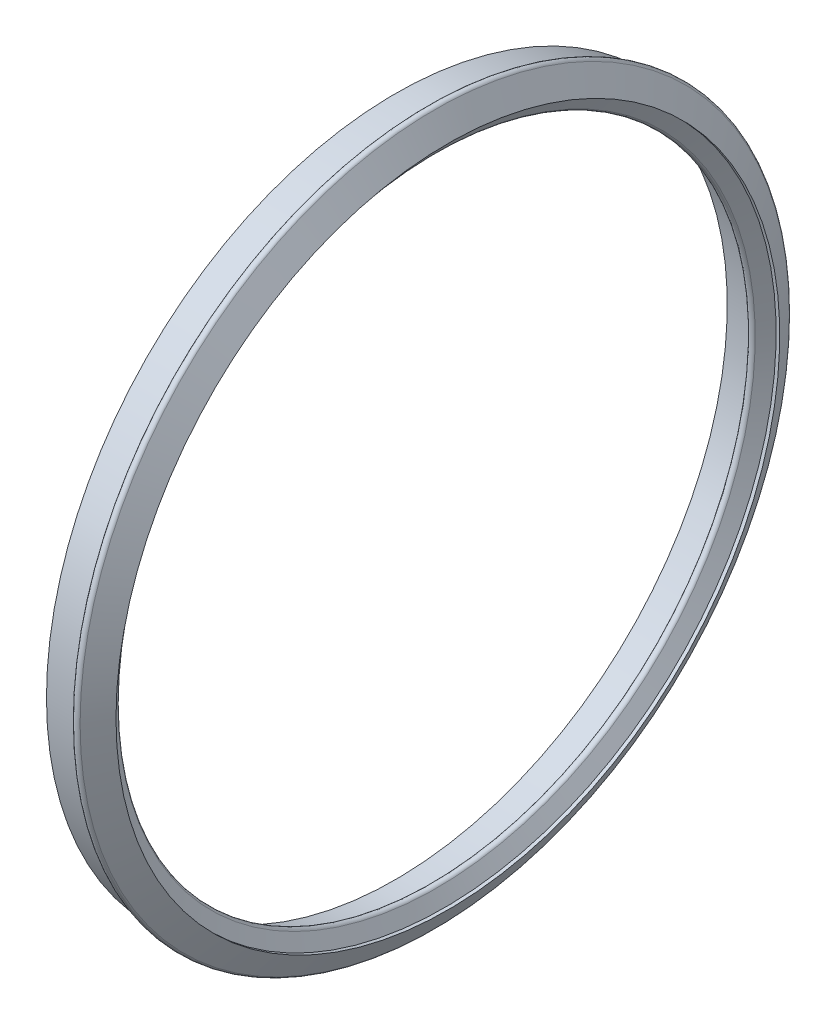
ISO-10303-21;
HEADER;
FILE_DESCRIPTION(('STEP AP214'),'2;1');
FILE_NAME('part.step','',(''),(''),'','','');
FILE_SCHEMA(('AUTOMOTIVE_DESIGN { 1 0 10303 214 1 1 1 1 }'));
ENDSEC;
DATA;
#1=APPLICATION_CONTEXT('core data for automotive mechanical design processes');
#2=APPLICATION_PROTOCOL_DEFINITION('international standard','automotive_design',2000,#1);
#3=PRODUCT_CONTEXT('',#1,'mechanical');
#4=PRODUCT('Part','Part','',(#3));
#5=PRODUCT_RELATED_PRODUCT_CATEGORY('part','',(#4));
#6=PRODUCT_DEFINITION_FORMATION('','',#4);
#7=PRODUCT_DEFINITION_CONTEXT('part definition',#1,'design');
#8=PRODUCT_DEFINITION('design','',#6,#7);
#9=PRODUCT_DEFINITION_SHAPE('','',#8);
#10=(LENGTH_UNIT() NAMED_UNIT(*) SI_UNIT(.MILLI.,.METRE.));
#11=(NAMED_UNIT(*) PLANE_ANGLE_UNIT() SI_UNIT($,.RADIAN.));
#12=(NAMED_UNIT(*) SI_UNIT($,.STERADIAN.) SOLID_ANGLE_UNIT());
#13=UNCERTAINTY_MEASURE_WITH_UNIT(LENGTH_MEASURE(1.E-05),#10,'distance_accuracy_value','');
#14=(GEOMETRIC_REPRESENTATION_CONTEXT(3) GLOBAL_UNCERTAINTY_ASSIGNED_CONTEXT((#13)) GLOBAL_UNIT_ASSIGNED_CONTEXT((#10,
#11,#12)) REPRESENTATION_CONTEXT('',''));
#15=CARTESIAN_POINT('',(0.,0.,0.));
#16=DIRECTION('',(0.,0.,1.));
#17=DIRECTION('',(1.,0.,0.));
#18=AXIS2_PLACEMENT_3D('',#15,#16,#17);
#19=CARTESIAN_POINT('',(0.,18.4,0.));
#20=DIRECTION('',(1.,0.,0.));
#21=DIRECTION('',(0.,0.,-1.));
#22=AXIS2_PLACEMENT_3D('',#19,#20,#21);
#23=PLANE('',#22);
#24=CARTESIAN_POINT('',(0.,0.,0.));
#25=DIRECTION('',(-1.,0.,0.));
#26=DIRECTION('',(0.,0.,1.));
#27=AXIS2_PLACEMENT_3D('',#24,#25,#26);
#28=CIRCLE('',#27,17.5);
#29=CARTESIAN_POINT('',(0.,0.,17.5));
#30=VERTEX_POINT('',#29);
#31=EDGE_CURVE('E10',#30,#30,#28,.T.);
#32=ORIENTED_EDGE('',*,*,#31,.F.);
#33=EDGE_LOOP('',(#32));
#34=FACE_BOUND('',#33,.T.);
#35=CARTESIAN_POINT('',(0.,0.,0.));
#36=DIRECTION('',(-1.,0.,0.));
#37=DIRECTION('',(0.,0.,1.));
#38=AXIS2_PLACEMENT_3D('',#35,#36,#37);
#39=CIRCLE('',#38,18.4);
#40=CARTESIAN_POINT('',(0.,0.,18.4));
#41=VERTEX_POINT('',#40);
#42=EDGE_CURVE('E71',#41,#41,#39,.T.);
#43=ORIENTED_EDGE('',*,*,#42,.T.);
#44=EDGE_LOOP('',(#43));
#45=FACE_BOUND('',#44,.T.);
#46=ADVANCED_FACE('F37',(#34,#45),#23,.F.);
#47=CARTESIAN_POINT('',(0.,0.,0.));
#48=DIRECTION('',(-1.,0.,0.));
#49=DIRECTION('',(0.,0.,1.));
#50=AXIS2_PLACEMENT_3D('',#47,#48,#49);
#51=CYLINDRICAL_SURFACE('',#50,17.5);
#52=CARTESIAN_POINT('',(1.42264973081043,0.,0.));
#53=DIRECTION('',(-1.,0.,0.));
#54=DIRECTION('',(0.,0.,1.));
#55=AXIS2_PLACEMENT_3D('',#52,#53,#54);
#56=CIRCLE('',#55,17.5);
#57=CARTESIAN_POINT('',(1.42264973081043,0.,17.5));
#58=VERTEX_POINT('',#57);
#59=EDGE_CURVE('E43',#58,#58,#56,.T.);
#60=ORIENTED_EDGE('',*,*,#59,.F.);
#61=EDGE_LOOP('',(#60));
#62=FACE_BOUND('',#61,.T.);
#63=ORIENTED_EDGE('',*,*,#31,.T.);
#64=EDGE_LOOP('',(#63));
#65=FACE_BOUND('',#64,.T.);
#66=ADVANCED_FACE('F120',(#62,#65),#51,.F.);
#67=CARTESIAN_POINT('',(1.42264973081043,0.,0.));
#68=DIRECTION('',(-1.,0.,0.));
#69=DIRECTION('',(0.,0.,1.));
#70=AXIS2_PLACEMENT_3D('',#67,#68,#69);
#71=CONICAL_SURFACE('',#70,17.5,1.04719755119667);
#72=CARTESIAN_POINT('',(1.82679491924312,0.,0.));
#73=DIRECTION('',(-1.,0.,0.));
#74=DIRECTION('',(0.,0.,1.));
#75=AXIS2_PLACEMENT_3D('',#72,#73,#74);
#76=CIRCLE('',#75,16.8);
#77=CARTESIAN_POINT('',(1.82679491924312,0.,16.8));
#78=VERTEX_POINT('',#77);
#79=EDGE_CURVE('E47',#78,#78,#76,.T.);
#80=ORIENTED_EDGE('',*,*,#79,.F.);
#81=EDGE_LOOP('',(#80));
#82=FACE_BOUND('',#81,.T.);
#83=ORIENTED_EDGE('',*,*,#59,.T.);
#84=EDGE_LOOP('',(#83));
#85=FACE_BOUND('',#84,.T.);
#86=ADVANCED_FACE('F115',(#82,#85),#71,.F.);
#87=CARTESIAN_POINT('',(1.99999999999999,0.,0.));
#88=DIRECTION('',(-1.,0.,0.));
#89=DIRECTION('',(0.,0.,1.));
#90=AXIS2_PLACEMENT_3D('',#87,#88,#89);
#91=TOROIDAL_SURFACE('',#90,16.9000000000001,0.200000000000047);
#92=CARTESIAN_POINT('',(2.17320508075694,0.,0.));
#93=DIRECTION('',(-1.,0.,0.));
#94=DIRECTION('',(0.,0.,1.));
#95=AXIS2_PLACEMENT_3D('',#92,#93,#94);
#96=CIRCLE('',#95,16.8);
#97=CARTESIAN_POINT('',(2.17320508075694,0.,16.8));
#98=VERTEX_POINT('',#97);
#99=EDGE_CURVE('E51',#98,#98,#96,.T.);
#100=ORIENTED_EDGE('',*,*,#99,.F.);
#101=EDGE_LOOP('',(#100));
#102=FACE_BOUND('',#101,.T.);
#103=ORIENTED_EDGE('',*,*,#79,.T.);
#104=EDGE_LOOP('',(#103));
#105=FACE_BOUND('',#104,.T.);
#106=ADVANCED_FACE('F109',(#102,#105),#91,.T.);
#107=CARTESIAN_POINT('',(2.17320508075694,0.,0.));
#108=DIRECTION('',(1.,0.,0.));
#109=DIRECTION('',(0.,0.,-1.));
#110=AXIS2_PLACEMENT_3D('',#107,#108,#109);
#111=CONICAL_SURFACE('',#110,16.8,1.04719755119661);
#112=CARTESIAN_POINT('',(2.57735026918967,0.,0.));
#113=DIRECTION('',(-1.,0.,0.));
#114=DIRECTION('',(0.,0.,1.));
#115=AXIS2_PLACEMENT_3D('',#112,#113,#114);
#116=CIRCLE('',#115,17.5);
#117=CARTESIAN_POINT('',(2.57735026918967,0.,17.5));
#118=VERTEX_POINT('',#117);
#119=EDGE_CURVE('E56',#118,#118,#116,.T.);
#120=ORIENTED_EDGE('',*,*,#119,.F.);
#121=EDGE_LOOP('',(#120));
#122=FACE_BOUND('',#121,.T.);
#123=ORIENTED_EDGE('',*,*,#99,.T.);
#124=EDGE_LOOP('',(#123));
#125=FACE_BOUND('',#124,.T.);
#126=ADVANCED_FACE('F103',(#122,#125),#111,.F.);
#127=CARTESIAN_POINT('',(0.,0.,0.));
#128=DIRECTION('',(-1.,0.,0.));
#129=DIRECTION('',(0.,0.,1.));
#130=AXIS2_PLACEMENT_3D('',#127,#128,#129);
#131=CYLINDRICAL_SURFACE('',#130,17.5);
#132=CARTESIAN_POINT('',(2.76602540378454,0.,0.));
#133=DIRECTION('',(-1.,0.,0.));
#134=DIRECTION('',(0.,0.,1.));
#135=AXIS2_PLACEMENT_3D('',#132,#133,#134);
#136=CIRCLE('',#135,17.5);
#137=CARTESIAN_POINT('',(2.76602540378454,0.,17.5));
#138=VERTEX_POINT('',#137);
#139=EDGE_CURVE('E59',#138,#138,#136,.T.);
#140=ORIENTED_EDGE('',*,*,#139,.F.);
#141=EDGE_LOOP('',(#140));
#142=FACE_BOUND('',#141,.T.);
#143=ORIENTED_EDGE('',*,*,#119,.T.);
#144=EDGE_LOOP('',(#143));
#145=FACE_BOUND('',#144,.T.);
#146=ADVANCED_FACE('F97',(#142,#145),#131,.F.);
#147=CARTESIAN_POINT('',(2.76602540378454,0.,0.));
#148=DIRECTION('',(-1.,0.,0.));
#149=DIRECTION('',(0.,0.,1.));
#150=AXIS2_PLACEMENT_3D('',#147,#148,#149);
#151=CONICAL_SURFACE('',#150,17.5,1.04719755119659);
#152=CARTESIAN_POINT('',(2.07320508075695,0.,0.));
#153=DIRECTION('',(-1.,0.,0.));
#154=DIRECTION('',(0.,0.,1.));
#155=AXIS2_PLACEMENT_3D('',#152,#153,#154);
#156=CIRCLE('',#155,18.7000000000001);
#157=CARTESIAN_POINT('',(2.07320508075695,0.,18.7000000000001));
#158=VERTEX_POINT('',#157);
#159=EDGE_CURVE('E62',#158,#158,#156,.T.);
#160=ORIENTED_EDGE('',*,*,#159,.F.);
#161=EDGE_LOOP('',(#160));
#162=FACE_BOUND('',#161,.T.);
#163=ORIENTED_EDGE('',*,*,#139,.T.);
#164=EDGE_LOOP('',(#163));
#165=FACE_BOUND('',#164,.T.);
#166=ADVANCED_FACE('F91',(#162,#165),#151,.T.);
#167=CARTESIAN_POINT('',(1.90000000000006,0.,0.));
#168=DIRECTION('',(-1.,0.,0.));
#169=DIRECTION('',(0.,0.,1.));
#170=AXIS2_PLACEMENT_3D('',#167,#168,#169);
#171=TOROIDAL_SURFACE('',#170,18.6000000000001,0.2);
#172=CARTESIAN_POINT('',(1.72679491924317,0.,0.));
#173=DIRECTION('',(-1.,0.,0.));
#174=DIRECTION('',(0.,0.,1.));
#175=AXIS2_PLACEMENT_3D('',#172,#173,#174);
#176=CIRCLE('',#175,18.7000000000001);
#177=CARTESIAN_POINT('',(1.72679491924317,0.,18.7000000000001));
#178=VERTEX_POINT('',#177);
#179=EDGE_CURVE('E65',#178,#178,#176,.T.);
#180=ORIENTED_EDGE('',*,*,#179,.F.);
#181=EDGE_LOOP('',(#180));
#182=FACE_BOUND('',#181,.T.);
#183=ORIENTED_EDGE('',*,*,#159,.T.);
#184=EDGE_LOOP('',(#183));
#185=FACE_BOUND('',#184,.T.);
#186=ADVANCED_FACE('F85',(#182,#185),#171,.T.);
#187=CARTESIAN_POINT('',(1.72679491924317,0.,0.));
#188=DIRECTION('',(1.,0.,0.));
#189=DIRECTION('',(0.,0.,-1.));
#190=AXIS2_PLACEMENT_3D('',#187,#188,#189);
#191=CONICAL_SURFACE('',#190,18.7000000000001,1.0471975511966);
#192=CARTESIAN_POINT('',(1.55358983848625,0.,0.));
#193=DIRECTION('',(-1.,0.,0.));
#194=DIRECTION('',(0.,0.,1.));
#195=AXIS2_PLACEMENT_3D('',#192,#193,#194);
#196=CIRCLE('',#195,18.4);
#197=CARTESIAN_POINT('',(1.55358983848625,0.,18.4));
#198=VERTEX_POINT('',#197);
#199=EDGE_CURVE('E68',#198,#198,#196,.T.);
#200=ORIENTED_EDGE('',*,*,#199,.F.);
#201=EDGE_LOOP('',(#200));
#202=FACE_BOUND('',#201,.T.);
#203=ORIENTED_EDGE('',*,*,#179,.T.);
#204=EDGE_LOOP('',(#203));
#205=FACE_BOUND('',#204,.T.);
#206=ADVANCED_FACE('F79',(#202,#205),#191,.T.);
#207=CARTESIAN_POINT('',(0.,0.,0.));
#208=DIRECTION('',(-1.,0.,0.));
#209=DIRECTION('',(0.,0.,1.));
#210=AXIS2_PLACEMENT_3D('',#207,#208,#209);
#211=CYLINDRICAL_SURFACE('',#210,18.4);
#212=ORIENTED_EDGE('',*,*,#42,.F.);
#213=EDGE_LOOP('',(#212));
#214=FACE_BOUND('',#213,.T.);
#215=ORIENTED_EDGE('',*,*,#199,.T.);
#216=EDGE_LOOP('',(#215));
#217=FACE_BOUND('',#216,.T.);
#218=ADVANCED_FACE('F76',(#214,#217),#211,.T.);
#219=CLOSED_SHELL('',(#46,#66,#86,#106,#126,#146,#166,#186,#206,#218));
#220=MANIFOLD_SOLID_BREP('B2',#219);
#221=ADVANCED_BREP_SHAPE_REPRESENTATION('',(#18,#220),#14);
#222=SHAPE_DEFINITION_REPRESENTATION(#9,#221);
ENDSEC;
END-ISO-10303-21;
